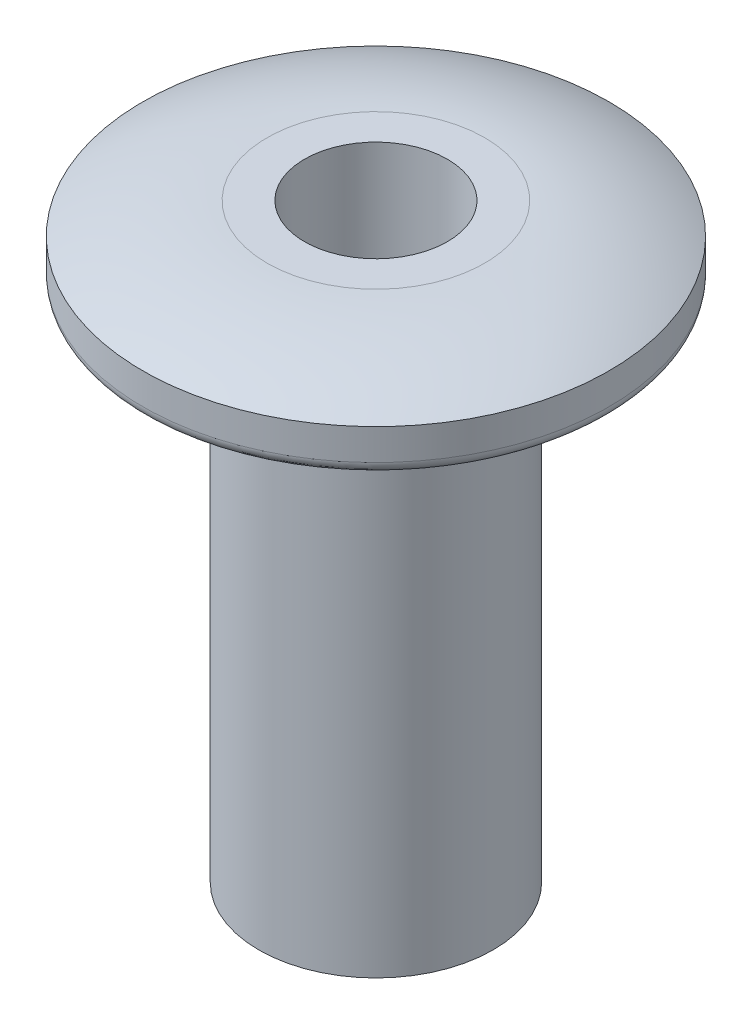
ISO-10303-21;
HEADER;
FILE_DESCRIPTION(('STEP AP214'),'2;1');
FILE_NAME('part.step','',(''),(''),'','','');
FILE_SCHEMA(('AUTOMOTIVE_DESIGN { 1 0 10303 214 1 1 1 1 }'));
ENDSEC;
DATA;
#1=APPLICATION_CONTEXT('core data for automotive mechanical design processes');
#2=APPLICATION_PROTOCOL_DEFINITION('international standard','automotive_design',2000,#1);
#3=PRODUCT_CONTEXT('',#1,'mechanical');
#4=PRODUCT('Part','Part','',(#3));
#5=PRODUCT_RELATED_PRODUCT_CATEGORY('part','',(#4));
#6=PRODUCT_DEFINITION_FORMATION('','',#4);
#7=PRODUCT_DEFINITION_CONTEXT('part definition',#1,'design');
#8=PRODUCT_DEFINITION('design','',#6,#7);
#9=PRODUCT_DEFINITION_SHAPE('','',#8);
#10=(LENGTH_UNIT() NAMED_UNIT(*) SI_UNIT(.MILLI.,.METRE.));
#11=(NAMED_UNIT(*) PLANE_ANGLE_UNIT() SI_UNIT($,.RADIAN.));
#12=(NAMED_UNIT(*) SI_UNIT($,.STERADIAN.) SOLID_ANGLE_UNIT());
#13=UNCERTAINTY_MEASURE_WITH_UNIT(LENGTH_MEASURE(1.E-05),#10,'distance_accuracy_value','');
#14=(GEOMETRIC_REPRESENTATION_CONTEXT(3) GLOBAL_UNCERTAINTY_ASSIGNED_CONTEXT((#13)) GLOBAL_UNIT_ASSIGNED_CONTEXT((#10,
#11,#12)) REPRESENTATION_CONTEXT('',''));
#15=CARTESIAN_POINT('',(0.,0.,0.));
#16=DIRECTION('',(0.,0.,1.));
#17=DIRECTION('',(1.,0.,0.));
#18=AXIS2_PLACEMENT_3D('',#15,#16,#17);
#19=CARTESIAN_POINT('',(-2.39395,0.,0.));
#20=DIRECTION('',(0.,1.,0.));
#21=DIRECTION('',(0.,0.,1.));
#22=AXIS2_PLACEMENT_3D('',#19,#20,#21);
#23=PLANE('',#22);
#24=CARTESIAN_POINT('',(0.,0.,0.));
#25=DIRECTION('',(0.,-1.,0.));
#26=DIRECTION('',(0.,0.,-1.));
#27=AXIS2_PLACEMENT_3D('',#24,#25,#26);
#28=CIRCLE('',#27,1.4605);
#29=CARTESIAN_POINT('',(0.,0.,-1.4605));
#30=VERTEX_POINT('',#29);
#31=EDGE_CURVE('E10',#30,#30,#28,.T.);
#32=ORIENTED_EDGE('',*,*,#31,.F.);
#33=EDGE_LOOP('',(#32));
#34=FACE_BOUND('',#33,.T.);
#35=CARTESIAN_POINT('',(0.,0.,0.));
#36=DIRECTION('',(0.,-1.,0.));
#37=DIRECTION('',(0.,0.,-1.));
#38=AXIS2_PLACEMENT_3D('',#35,#36,#37);
#39=CIRCLE('',#38,2.39395);
#40=CARTESIAN_POINT('',(0.,0.,-2.39395));
#41=VERTEX_POINT('',#40);
#42=EDGE_CURVE('E59',#41,#41,#39,.T.);
#43=ORIENTED_EDGE('',*,*,#42,.T.);
#44=EDGE_LOOP('',(#43));
#45=FACE_BOUND('',#44,.T.);
#46=ADVANCED_FACE('F31',(#34,#45),#23,.F.);
#47=CARTESIAN_POINT('',(0.,0.,0.));
#48=DIRECTION('',(0.,-1.,0.));
#49=DIRECTION('',(0.,0.,-1.));
#50=AXIS2_PLACEMENT_3D('',#47,#48,#49);
#51=CYLINDRICAL_SURFACE('',#50,1.4605);
#52=CARTESIAN_POINT('',(0.,12.065,0.));
#53=DIRECTION('',(0.,-1.,0.));
#54=DIRECTION('',(0.,0.,-1.));
#55=AXIS2_PLACEMENT_3D('',#52,#53,#54);
#56=CIRCLE('',#55,1.4605);
#57=CARTESIAN_POINT('',(0.,12.065,-1.4605));
#58=VERTEX_POINT('',#57);
#59=EDGE_CURVE('E37',#58,#58,#56,.T.);
#60=ORIENTED_EDGE('',*,*,#59,.F.);
#61=EDGE_LOOP('',(#60));
#62=FACE_BOUND('',#61,.T.);
#63=ORIENTED_EDGE('',*,*,#31,.T.);
#64=EDGE_LOOP('',(#63));
#65=FACE_BOUND('',#64,.T.);
#66=ADVANCED_FACE('F96',(#62,#65),#51,.F.);
#67=CARTESIAN_POINT('',(-1.4605,12.065,0.));
#68=DIRECTION('',(0.,-1.,0.));
#69=DIRECTION('',(0.,0.,-1.));
#70=AXIS2_PLACEMENT_3D('',#67,#68,#69);
#71=PLANE('',#70);
#72=CARTESIAN_POINT('',(0.,12.065,0.));
#73=DIRECTION('',(0.,-1.,0.));
#74=DIRECTION('',(0.,0.,-1.));
#75=AXIS2_PLACEMENT_3D('',#72,#73,#74);
#76=CIRCLE('',#75,2.2225);
#77=CARTESIAN_POINT('',(0.,12.065,-2.2225));
#78=VERTEX_POINT('',#77);
#79=EDGE_CURVE('E41',#78,#78,#76,.T.);
#80=ORIENTED_EDGE('',*,*,#79,.F.);
#81=EDGE_LOOP('',(#80));
#82=FACE_BOUND('',#81,.T.);
#83=ORIENTED_EDGE('',*,*,#59,.T.);
#84=EDGE_LOOP('',(#83));
#85=FACE_BOUND('',#84,.T.);
#86=ADVANCED_FACE('F91',(#82,#85),#71,.F.);
#87=CARTESIAN_POINT('',(0.,6.66749999999997,0.));
#88=DIRECTION('',(0.,-1.,0.));
#89=DIRECTION('',(0.,0.,-1.));
#90=AXIS2_PLACEMENT_3D('',#87,#88,#89);
#91=DEGENERATE_TOROIDAL_SURFACE('',#90,2.2225,5.39750000000002,.T.);
#92=CARTESIAN_POINT('',(0.,11.43,0.));
#93=DIRECTION('',(0.,-1.,0.));
#94=DIRECTION('',(0.,0.,-1.));
#95=AXIS2_PLACEMENT_3D('',#92,#93,#94);
#96=CIRCLE('',#95,4.7625);
#97=CARTESIAN_POINT('',(0.,11.43,-4.7625));
#98=VERTEX_POINT('',#97);
#99=EDGE_CURVE('E45',#98,#98,#96,.T.);
#100=ORIENTED_EDGE('',*,*,#99,.F.);
#101=EDGE_LOOP('',(#100));
#102=FACE_BOUND('',#101,.T.);
#103=ORIENTED_EDGE('',*,*,#79,.T.);
#104=EDGE_LOOP('',(#103));
#105=FACE_BOUND('',#104,.T.);
#106=ADVANCED_FACE('F85',(#102,#105),#91,.T.);
#107=CARTESIAN_POINT('',(0.,0.,0.));
#108=DIRECTION('',(0.,-1.,0.));
#109=DIRECTION('',(0.,0.,-1.));
#110=AXIS2_PLACEMENT_3D('',#107,#108,#109);
#111=CYLINDRICAL_SURFACE('',#110,4.7625);
#112=CARTESIAN_POINT('',(0.,10.795,0.));
#113=DIRECTION('',(0.,-1.,0.));
#114=DIRECTION('',(0.,0.,-1.));
#115=AXIS2_PLACEMENT_3D('',#112,#113,#114);
#116=CIRCLE('',#115,4.7625);
#117=CARTESIAN_POINT('',(0.,10.795,-4.7625));
#118=VERTEX_POINT('',#117);
#119=EDGE_CURVE('E50',#118,#118,#116,.T.);
#120=ORIENTED_EDGE('',*,*,#119,.F.);
#121=EDGE_LOOP('',(#120));
#122=FACE_BOUND('',#121,.T.);
#123=ORIENTED_EDGE('',*,*,#99,.T.);
#124=EDGE_LOOP('',(#123));
#125=FACE_BOUND('',#124,.T.);
#126=ADVANCED_FACE('F79',(#122,#125),#111,.T.);
#127=CARTESIAN_POINT('',(0.,10.795,0.));
#128=DIRECTION('',(0.,-1.,0.));
#129=DIRECTION('',(0.,0.,-1.));
#130=AXIS2_PLACEMENT_3D('',#127,#128,#129);
#131=TOROIDAL_SURFACE('',#130,4.5085,0.254000000000002);
#132=CARTESIAN_POINT('',(0.,10.541,0.));
#133=DIRECTION('',(0.,-1.,0.));
#134=DIRECTION('',(0.,0.,-1.));
#135=AXIS2_PLACEMENT_3D('',#132,#133,#134);
#136=CIRCLE('',#135,4.5085);
#137=CARTESIAN_POINT('',(0.,10.541,-4.5085));
#138=VERTEX_POINT('',#137);
#139=EDGE_CURVE('E53',#138,#138,#136,.T.);
#140=ORIENTED_EDGE('',*,*,#139,.F.);
#141=EDGE_LOOP('',(#140));
#142=FACE_BOUND('',#141,.T.);
#143=ORIENTED_EDGE('',*,*,#119,.T.);
#144=EDGE_LOOP('',(#143));
#145=FACE_BOUND('',#144,.T.);
#146=ADVANCED_FACE('F73',(#142,#145),#131,.T.);
#147=CARTESIAN_POINT('',(-4.5085,10.541,0.));
#148=DIRECTION('',(0.,1.,0.));
#149=DIRECTION('',(0.,0.,1.));
#150=AXIS2_PLACEMENT_3D('',#147,#148,#149);
#151=PLANE('',#150);
#152=CARTESIAN_POINT('',(0.,10.541,0.));
#153=DIRECTION('',(0.,-1.,0.));
#154=DIRECTION('',(0.,0.,-1.));
#155=AXIS2_PLACEMENT_3D('',#152,#153,#154);
#156=CIRCLE('',#155,2.39395);
#157=CARTESIAN_POINT('',(0.,10.541,-2.39395));
#158=VERTEX_POINT('',#157);
#159=EDGE_CURVE('E56',#158,#158,#156,.T.);
#160=ORIENTED_EDGE('',*,*,#159,.F.);
#161=EDGE_LOOP('',(#160));
#162=FACE_BOUND('',#161,.T.);
#163=ORIENTED_EDGE('',*,*,#139,.T.);
#164=EDGE_LOOP('',(#163));
#165=FACE_BOUND('',#164,.T.);
#166=ADVANCED_FACE('F67',(#162,#165),#151,.F.);
#167=CARTESIAN_POINT('',(0.,0.,0.));
#168=DIRECTION('',(0.,-1.,0.));
#169=DIRECTION('',(0.,0.,-1.));
#170=AXIS2_PLACEMENT_3D('',#167,#168,#169);
#171=CYLINDRICAL_SURFACE('',#170,2.39395);
#172=ORIENTED_EDGE('',*,*,#42,.F.);
#173=EDGE_LOOP('',(#172));
#174=FACE_BOUND('',#173,.T.);
#175=ORIENTED_EDGE('',*,*,#159,.T.);
#176=EDGE_LOOP('',(#175));
#177=FACE_BOUND('',#176,.T.);
#178=ADVANCED_FACE('F64',(#174,#177),#171,.T.);
#179=CLOSED_SHELL('',(#46,#66,#86,#106,#126,#146,#166,#178));
#180=MANIFOLD_SOLID_BREP('B2',#179);
#181=ADVANCED_BREP_SHAPE_REPRESENTATION('',(#18,#180),#14);
#182=SHAPE_DEFINITION_REPRESENTATION(#9,#181);
ENDSEC;
END-ISO-10303-21;
